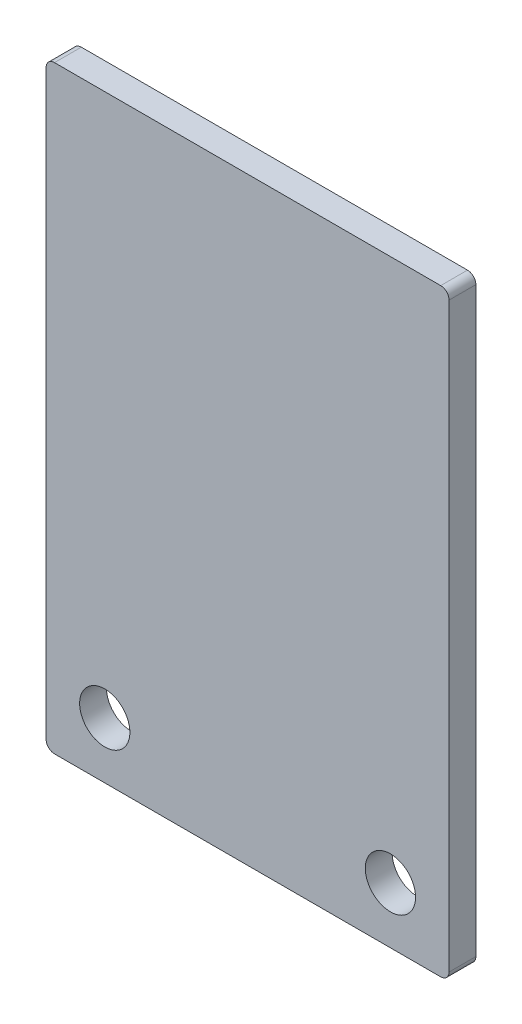
ISO-10303-21;
HEADER;
FILE_DESCRIPTION(('STEP AP214'),'2;1');
FILE_NAME('part.step','',(''),(''),'','','');
FILE_SCHEMA(('AUTOMOTIVE_DESIGN { 1 0 10303 214 1 1 1 1 }'));
ENDSEC;
DATA;
#1=APPLICATION_CONTEXT('core data for automotive mechanical design processes');
#2=APPLICATION_PROTOCOL_DEFINITION('international standard','automotive_design',2000,#1);
#3=PRODUCT_CONTEXT('',#1,'mechanical');
#4=PRODUCT('Part','Part','',(#3));
#5=PRODUCT_RELATED_PRODUCT_CATEGORY('part','',(#4));
#6=PRODUCT_DEFINITION_FORMATION('','',#4);
#7=PRODUCT_DEFINITION_CONTEXT('part definition',#1,'design');
#8=PRODUCT_DEFINITION('design','',#6,#7);
#9=PRODUCT_DEFINITION_SHAPE('','',#8);
#10=(LENGTH_UNIT() NAMED_UNIT(*) SI_UNIT(.MILLI.,.METRE.));
#11=(NAMED_UNIT(*) PLANE_ANGLE_UNIT() SI_UNIT($,.RADIAN.));
#12=(NAMED_UNIT(*) SI_UNIT($,.STERADIAN.) SOLID_ANGLE_UNIT());
#13=UNCERTAINTY_MEASURE_WITH_UNIT(LENGTH_MEASURE(1.E-05),#10,'distance_accuracy_value','');
#14=(GEOMETRIC_REPRESENTATION_CONTEXT(3) GLOBAL_UNCERTAINTY_ASSIGNED_CONTEXT((#13)) GLOBAL_UNIT_ASSIGNED_CONTEXT((#10,
#11,#12)) REPRESENTATION_CONTEXT('',''));
#15=CARTESIAN_POINT('',(0.,0.,0.));
#16=DIRECTION('',(0.,0.,1.));
#17=DIRECTION('',(1.,0.,0.));
#18=AXIS2_PLACEMENT_3D('',#15,#16,#17);
#19=CARTESIAN_POINT('',(0.500000000000001,0.5,1.6));
#20=DIRECTION('',(0.,0.,-1.));
#21=DIRECTION('',(-1.,0.,0.));
#22=AXIS2_PLACEMENT_3D('',#19,#20,#21);
#23=CYLINDRICAL_SURFACE('',#22,0.5);
#24=CARTESIAN_POINT('',(0.500000000000001,0.5,0.));
#25=DIRECTION('',(0.,0.,1.));
#26=DIRECTION('',(1.,0.,0.));
#27=AXIS2_PLACEMENT_3D('',#24,#25,#26);
#28=CIRCLE('',#27,0.5);
#29=CARTESIAN_POINT('',(0.,0.5,0.));
#30=VERTEX_POINT('',#29);
#31=CARTESIAN_POINT('',(0.5,0.,0.));
#32=VERTEX_POINT('',#31);
#33=EDGE_CURVE('E137',#30,#32,#28,.T.);
#34=ORIENTED_EDGE('',*,*,#33,.T.);
#35=DIRECTION('',(0.,0.,-1.));
#36=VECTOR('',#35,1.);
#37=CARTESIAN_POINT('',(0.5,0.,1.6));
#38=LINE('',#37,#36);
#39=CARTESIAN_POINT('',(0.5,0.,1.6));
#40=VERTEX_POINT('',#39);
#41=EDGE_CURVE('E11',#40,#32,#38,.T.);
#42=ORIENTED_EDGE('',*,*,#41,.F.);
#43=CARTESIAN_POINT('',(0.500000000000001,0.5,1.6));
#44=DIRECTION('',(0.,0.,1.));
#45=DIRECTION('',(1.,0.,0.));
#46=AXIS2_PLACEMENT_3D('',#43,#44,#45);
#47=CIRCLE('',#46,0.5);
#48=CARTESIAN_POINT('',(0.,0.5,1.6));
#49=VERTEX_POINT('',#48);
#50=EDGE_CURVE('E155',#49,#40,#47,.T.);
#51=ORIENTED_EDGE('',*,*,#50,.F.);
#52=DIRECTION('',(0.,0.,-1.));
#53=VECTOR('',#52,1.);
#54=CARTESIAN_POINT('',(0.,0.5,1.6));
#55=LINE('',#54,#53);
#56=EDGE_CURVE('E133',#49,#30,#55,.T.);
#57=ORIENTED_EDGE('',*,*,#56,.T.);
#58=EDGE_LOOP('',(#34,#42,#51,#57));
#59=FACE_BOUND('',#58,.T.);
#60=ADVANCED_FACE('F41',(#59),#23,.T.);
#61=CARTESIAN_POINT('',(0.5,0.,1.6));
#62=DIRECTION('',(0.,1.,0.));
#63=DIRECTION('',(0.,0.,1.));
#64=AXIS2_PLACEMENT_3D('',#61,#62,#63);
#65=PLANE('',#64);
#66=DIRECTION('',(1.,0.,0.));
#67=VECTOR('',#66,1.);
#68=CARTESIAN_POINT('',(0.5,0.,0.));
#69=LINE('',#68,#67);
#70=CARTESIAN_POINT('',(23.55,0.,0.));
#71=VERTEX_POINT('',#70);
#72=EDGE_CURVE('E140',#32,#71,#69,.T.);
#73=ORIENTED_EDGE('',*,*,#72,.T.);
#74=DIRECTION('',(0.,0.,-1.));
#75=VECTOR('',#74,1.);
#76=CARTESIAN_POINT('',(23.55,0.,1.6));
#77=LINE('',#76,#75);
#78=CARTESIAN_POINT('',(23.55,0.,1.6));
#79=VERTEX_POINT('',#78);
#80=EDGE_CURVE('E47',#79,#71,#77,.T.);
#81=ORIENTED_EDGE('',*,*,#80,.F.);
#82=DIRECTION('',(1.,0.,0.));
#83=VECTOR('',#82,1.);
#84=CARTESIAN_POINT('',(0.5,0.,1.6));
#85=LINE('',#84,#83);
#86=EDGE_CURVE('E99',#40,#79,#85,.T.);
#87=ORIENTED_EDGE('',*,*,#86,.F.);
#88=ORIENTED_EDGE('',*,*,#41,.T.);
#89=EDGE_LOOP('',(#73,#81,#87,#88));
#90=FACE_BOUND('',#89,.T.);
#91=ADVANCED_FACE('F211',(#90),#65,.F.);
#92=CARTESIAN_POINT('',(23.55,0.500000000000003,1.6));
#93=DIRECTION('',(0.,0.,-1.));
#94=DIRECTION('',(-1.,0.,0.));
#95=AXIS2_PLACEMENT_3D('',#92,#93,#94);
#96=CYLINDRICAL_SURFACE('',#95,0.500000000000003);
#97=CARTESIAN_POINT('',(23.55,0.500000000000003,0.));
#98=DIRECTION('',(0.,0.,1.));
#99=DIRECTION('',(1.,0.,0.));
#100=AXIS2_PLACEMENT_3D('',#97,#98,#99);
#101=CIRCLE('',#100,0.500000000000003);
#102=CARTESIAN_POINT('',(24.05,0.500000000000003,0.));
#103=VERTEX_POINT('',#102);
#104=EDGE_CURVE('E141',#71,#103,#101,.T.);
#105=ORIENTED_EDGE('',*,*,#104,.T.);
#106=DIRECTION('',(0.,0.,-1.));
#107=VECTOR('',#106,1.);
#108=CARTESIAN_POINT('',(24.05,0.500000000000003,1.6));
#109=LINE('',#108,#107);
#110=CARTESIAN_POINT('',(24.05,0.500000000000003,1.6));
#111=VERTEX_POINT('',#110);
#112=EDGE_CURVE('E157',#111,#103,#109,.T.);
#113=ORIENTED_EDGE('',*,*,#112,.F.);
#114=CARTESIAN_POINT('',(23.55,0.500000000000003,1.6));
#115=DIRECTION('',(0.,0.,1.));
#116=DIRECTION('',(1.,0.,0.));
#117=AXIS2_PLACEMENT_3D('',#114,#115,#116);
#118=CIRCLE('',#117,0.500000000000003);
#119=EDGE_CURVE('E170',#79,#111,#118,.T.);
#120=ORIENTED_EDGE('',*,*,#119,.F.);
#121=ORIENTED_EDGE('',*,*,#80,.T.);
#122=EDGE_LOOP('',(#105,#113,#120,#121));
#123=FACE_BOUND('',#122,.T.);
#124=ADVANCED_FACE('F164',(#123),#96,.T.);
#125=CARTESIAN_POINT('',(24.05,0.5,1.6));
#126=DIRECTION('',(-1.,0.,0.));
#127=DIRECTION('',(0.,0.,1.));
#128=AXIS2_PLACEMENT_3D('',#125,#126,#127);
#129=PLANE('',#128);
#130=DIRECTION('',(0.,1.,0.));
#131=VECTOR('',#130,1.);
#132=CARTESIAN_POINT('',(24.05,0.5,0.));
#133=LINE('',#132,#131);
#134=CARTESIAN_POINT('',(24.05,35.23,0.));
#135=VERTEX_POINT('',#134);
#136=EDGE_CURVE('E144',#103,#135,#133,.T.);
#137=ORIENTED_EDGE('',*,*,#136,.T.);
#138=DIRECTION('',(0.,0.,-1.));
#139=VECTOR('',#138,1.);
#140=CARTESIAN_POINT('',(24.05,35.23,1.6));
#141=LINE('',#140,#139);
#142=CARTESIAN_POINT('',(24.05,35.23,1.6));
#143=VERTEX_POINT('',#142);
#144=EDGE_CURVE('E156',#143,#135,#141,.T.);
#145=ORIENTED_EDGE('',*,*,#144,.F.);
#146=DIRECTION('',(0.,1.,0.));
#147=VECTOR('',#146,1.);
#148=CARTESIAN_POINT('',(24.05,0.5,1.6));
#149=LINE('',#148,#147);
#150=EDGE_CURVE('E178',#111,#143,#149,.T.);
#151=ORIENTED_EDGE('',*,*,#150,.F.);
#152=ORIENTED_EDGE('',*,*,#112,.T.);
#153=EDGE_LOOP('',(#137,#145,#151,#152));
#154=FACE_BOUND('',#153,.T.);
#155=ADVANCED_FACE('F171',(#154),#129,.F.);
#156=CARTESIAN_POINT('',(23.55,35.23,1.6));
#157=DIRECTION('',(0.,0.,-1.));
#158=DIRECTION('',(-1.,0.,0.));
#159=AXIS2_PLACEMENT_3D('',#156,#157,#158);
#160=CYLINDRICAL_SURFACE('',#159,0.499999999999994);
#161=CARTESIAN_POINT('',(23.55,35.23,0.));
#162=DIRECTION('',(0.,0.,1.));
#163=DIRECTION('',(1.,0.,0.));
#164=AXIS2_PLACEMENT_3D('',#161,#162,#163);
#165=CIRCLE('',#164,0.499999999999994);
#166=CARTESIAN_POINT('',(23.55,35.73,0.));
#167=VERTEX_POINT('',#166);
#168=EDGE_CURVE('E150',#135,#167,#165,.T.);
#169=ORIENTED_EDGE('',*,*,#168,.T.);
#170=DIRECTION('',(0.,0.,-1.));
#171=VECTOR('',#170,1.);
#172=CARTESIAN_POINT('',(23.55,35.73,1.6));
#173=LINE('',#172,#171);
#174=CARTESIAN_POINT('',(23.55,35.73,1.6));
#175=VERTEX_POINT('',#174);
#176=EDGE_CURVE('E126',#175,#167,#173,.T.);
#177=ORIENTED_EDGE('',*,*,#176,.F.);
#178=CARTESIAN_POINT('',(23.55,35.23,1.6));
#179=DIRECTION('',(0.,0.,1.));
#180=DIRECTION('',(1.,0.,0.));
#181=AXIS2_PLACEMENT_3D('',#178,#179,#180);
#182=CIRCLE('',#181,0.499999999999994);
#183=EDGE_CURVE('E119',#143,#175,#182,.T.);
#184=ORIENTED_EDGE('',*,*,#183,.F.);
#185=ORIENTED_EDGE('',*,*,#144,.T.);
#186=EDGE_LOOP('',(#169,#177,#184,#185));
#187=FACE_BOUND('',#186,.T.);
#188=ADVANCED_FACE('F179',(#187),#160,.T.);
#189=CARTESIAN_POINT('',(23.55,35.73,1.6));
#190=DIRECTION('',(0.,-1.,0.));
#191=DIRECTION('',(0.,0.,-1.));
#192=AXIS2_PLACEMENT_3D('',#189,#190,#191);
#193=PLANE('',#192);
#194=DIRECTION('',(-1.,0.,0.));
#195=VECTOR('',#194,1.);
#196=CARTESIAN_POINT('',(23.55,35.73,0.));
#197=LINE('',#196,#195);
#198=CARTESIAN_POINT('',(0.5,35.73,0.));
#199=VERTEX_POINT('',#198);
#200=EDGE_CURVE('E130',#167,#199,#197,.T.);
#201=ORIENTED_EDGE('',*,*,#200,.T.);
#202=DIRECTION('',(0.,0.,-1.));
#203=VECTOR('',#202,1.);
#204=CARTESIAN_POINT('',(0.5,35.73,1.6));
#205=LINE('',#204,#203);
#206=CARTESIAN_POINT('',(0.5,35.73,1.6));
#207=VERTEX_POINT('',#206);
#208=EDGE_CURVE('E123',#207,#199,#205,.T.);
#209=ORIENTED_EDGE('',*,*,#208,.F.);
#210=DIRECTION('',(-1.,0.,0.));
#211=VECTOR('',#210,1.);
#212=CARTESIAN_POINT('',(23.55,35.73,1.6));
#213=LINE('',#212,#211);
#214=EDGE_CURVE('E114',#175,#207,#213,.T.);
#215=ORIENTED_EDGE('',*,*,#214,.F.);
#216=ORIENTED_EDGE('',*,*,#176,.T.);
#217=EDGE_LOOP('',(#201,#209,#215,#216));
#218=FACE_BOUND('',#217,.T.);
#219=ADVANCED_FACE('F125',(#218),#193,.F.);
#220=CARTESIAN_POINT('',(0.499999999999991,35.23,1.6));
#221=DIRECTION('',(0.,0.,-1.));
#222=DIRECTION('',(-1.,0.,0.));
#223=AXIS2_PLACEMENT_3D('',#220,#221,#222);
#224=CYLINDRICAL_SURFACE('',#223,0.499999999999989);
#225=CARTESIAN_POINT('',(0.499999999999991,35.23,0.));
#226=DIRECTION('',(0.,0.,1.));
#227=DIRECTION('',(1.,0.,0.));
#228=AXIS2_PLACEMENT_3D('',#225,#226,#227);
#229=CIRCLE('',#228,0.499999999999989);
#230=CARTESIAN_POINT('',(0.,35.23,0.));
#231=VERTEX_POINT('',#230);
#232=EDGE_CURVE('E88',#199,#231,#229,.T.);
#233=ORIENTED_EDGE('',*,*,#232,.T.);
#234=DIRECTION('',(0.,0.,-1.));
#235=VECTOR('',#234,1.);
#236=CARTESIAN_POINT('',(0.,35.23,1.6));
#237=LINE('',#236,#235);
#238=CARTESIAN_POINT('',(0.,35.23,1.6));
#239=VERTEX_POINT('',#238);
#240=EDGE_CURVE('E129',#239,#231,#237,.T.);
#241=ORIENTED_EDGE('',*,*,#240,.F.);
#242=CARTESIAN_POINT('',(0.499999999999991,35.23,1.6));
#243=DIRECTION('',(0.,0.,1.));
#244=DIRECTION('',(1.,0.,0.));
#245=AXIS2_PLACEMENT_3D('',#242,#243,#244);
#246=CIRCLE('',#245,0.499999999999989);
#247=EDGE_CURVE('E120',#207,#239,#246,.T.);
#248=ORIENTED_EDGE('',*,*,#247,.F.);
#249=ORIENTED_EDGE('',*,*,#208,.T.);
#250=EDGE_LOOP('',(#233,#241,#248,#249));
#251=FACE_BOUND('',#250,.T.);
#252=ADVANCED_FACE('F132',(#251),#224,.T.);
#253=CARTESIAN_POINT('',(0.,35.23,1.6));
#254=DIRECTION('',(1.,0.,0.));
#255=DIRECTION('',(0.,0.,-1.));
#256=AXIS2_PLACEMENT_3D('',#253,#254,#255);
#257=PLANE('',#256);
#258=DIRECTION('',(0.,-1.,0.));
#259=VECTOR('',#258,1.);
#260=CARTESIAN_POINT('',(0.,35.23,0.));
#261=LINE('',#260,#259);
#262=EDGE_CURVE('E95',#231,#30,#261,.T.);
#263=ORIENTED_EDGE('',*,*,#262,.T.);
#264=ORIENTED_EDGE('',*,*,#56,.F.);
#265=DIRECTION('',(0.,-1.,0.));
#266=VECTOR('',#265,1.);
#267=CARTESIAN_POINT('',(0.,35.23,1.6));
#268=LINE('',#267,#266);
#269=EDGE_CURVE('E60',#239,#49,#268,.T.);
#270=ORIENTED_EDGE('',*,*,#269,.F.);
#271=ORIENTED_EDGE('',*,*,#240,.T.);
#272=EDGE_LOOP('',(#263,#264,#270,#271));
#273=FACE_BOUND('',#272,.T.);
#274=ADVANCED_FACE('F217',(#273),#257,.F.);
#275=CARTESIAN_POINT('',(0.500000000000001,0.5,1.6));
#276=DIRECTION('',(0.,0.,1.));
#277=DIRECTION('',(1.,0.,0.));
#278=AXIS2_PLACEMENT_3D('',#275,#276,#277);
#279=PLANE('',#278);
#280=CARTESIAN_POINT('',(3.5,3.36,1.6));
#281=DIRECTION('',(0.,0.,1.));
#282=DIRECTION('',(1.,0.,0.));
#283=AXIS2_PLACEMENT_3D('',#280,#281,#282);
#284=CIRCLE('',#283,1.5);
#285=CARTESIAN_POINT('',(5.,3.36,1.6));
#286=VERTEX_POINT('',#285);
#287=EDGE_CURVE('E143',#286,#286,#284,.F.);
#288=ORIENTED_EDGE('',*,*,#287,.T.);
#289=EDGE_LOOP('',(#288));
#290=FACE_BOUND('',#289,.T.);
#291=CARTESIAN_POINT('',(20.55,3.36,1.6));
#292=DIRECTION('',(0.,0.,1.));
#293=DIRECTION('',(1.,0.,0.));
#294=AXIS2_PLACEMENT_3D('',#291,#292,#293);
#295=CIRCLE('',#294,1.5);
#296=CARTESIAN_POINT('',(22.05,3.36,1.6));
#297=VERTEX_POINT('',#296);
#298=EDGE_CURVE('E190',#297,#297,#295,.F.);
#299=ORIENTED_EDGE('',*,*,#298,.T.);
#300=EDGE_LOOP('',(#299));
#301=FACE_BOUND('',#300,.T.);
#302=ORIENTED_EDGE('',*,*,#50,.T.);
#303=ORIENTED_EDGE('',*,*,#86,.T.);
#304=ORIENTED_EDGE('',*,*,#119,.T.);
#305=ORIENTED_EDGE('',*,*,#150,.T.);
#306=ORIENTED_EDGE('',*,*,#183,.T.);
#307=ORIENTED_EDGE('',*,*,#214,.T.);
#308=ORIENTED_EDGE('',*,*,#247,.T.);
#309=ORIENTED_EDGE('',*,*,#269,.T.);
#310=EDGE_LOOP('',(#302,#303,#304,#305,#306,#307,#308,#309));
#311=FACE_BOUND('',#310,.T.);
#312=ADVANCED_FACE('F113',(#290,#301,#311),#279,.T.);
#313=CARTESIAN_POINT('',(0.500000000000001,0.5,0.));
#314=DIRECTION('',(0.,0.,1.));
#315=DIRECTION('',(1.,0.,0.));
#316=AXIS2_PLACEMENT_3D('',#313,#314,#315);
#317=PLANE('',#316);
#318=CARTESIAN_POINT('',(3.5,3.36,0.));
#319=DIRECTION('',(0.,0.,1.));
#320=DIRECTION('',(1.,0.,0.));
#321=AXIS2_PLACEMENT_3D('',#318,#319,#320);
#322=CIRCLE('',#321,1.5);
#323=CARTESIAN_POINT('',(5.,3.36,0.));
#324=VERTEX_POINT('',#323);
#325=EDGE_CURVE('E186',#324,#324,#322,.T.);
#326=ORIENTED_EDGE('',*,*,#325,.T.);
#327=EDGE_LOOP('',(#326));
#328=FACE_BOUND('',#327,.T.);
#329=CARTESIAN_POINT('',(20.55,3.36,0.));
#330=DIRECTION('',(0.,0.,1.));
#331=DIRECTION('',(1.,0.,0.));
#332=AXIS2_PLACEMENT_3D('',#329,#330,#331);
#333=CIRCLE('',#332,1.5);
#334=CARTESIAN_POINT('',(22.05,3.36,0.));
#335=VERTEX_POINT('',#334);
#336=EDGE_CURVE('E191',#335,#335,#333,.T.);
#337=ORIENTED_EDGE('',*,*,#336,.T.);
#338=EDGE_LOOP('',(#337));
#339=FACE_BOUND('',#338,.T.);
#340=ORIENTED_EDGE('',*,*,#33,.F.);
#341=ORIENTED_EDGE('',*,*,#262,.F.);
#342=ORIENTED_EDGE('',*,*,#232,.F.);
#343=ORIENTED_EDGE('',*,*,#200,.F.);
#344=ORIENTED_EDGE('',*,*,#168,.F.);
#345=ORIENTED_EDGE('',*,*,#136,.F.);
#346=ORIENTED_EDGE('',*,*,#104,.F.);
#347=ORIENTED_EDGE('',*,*,#72,.F.);
#348=EDGE_LOOP('',(#340,#341,#342,#343,#344,#345,#346,#347));
#349=FACE_BOUND('',#348,.T.);
#350=ADVANCED_FACE('F172',(#328,#339,#349),#317,.F.);
#351=CARTESIAN_POINT('',(20.55,3.36,2.));
#352=DIRECTION('',(0.,0.,-1.));
#353=DIRECTION('',(-1.,0.,0.));
#354=AXIS2_PLACEMENT_3D('',#351,#352,#353);
#355=CYLINDRICAL_SURFACE('',#354,1.5);
#356=ORIENTED_EDGE('',*,*,#298,.F.);
#357=EDGE_LOOP('',(#356));
#358=FACE_BOUND('',#357,.T.);
#359=ORIENTED_EDGE('',*,*,#336,.F.);
#360=EDGE_LOOP('',(#359));
#361=FACE_BOUND('',#360,.T.);
#362=ADVANCED_FACE('F203',(#358,#361),#355,.F.);
#363=CARTESIAN_POINT('',(3.5,3.36,2.));
#364=DIRECTION('',(0.,0.,-1.));
#365=DIRECTION('',(-1.,0.,0.));
#366=AXIS2_PLACEMENT_3D('',#363,#364,#365);
#367=CYLINDRICAL_SURFACE('',#366,1.5);
#368=ORIENTED_EDGE('',*,*,#287,.F.);
#369=EDGE_LOOP('',(#368));
#370=FACE_BOUND('',#369,.T.);
#371=ORIENTED_EDGE('',*,*,#325,.F.);
#372=EDGE_LOOP('',(#371));
#373=FACE_BOUND('',#372,.T.);
#374=ADVANCED_FACE('F200',(#370,#373),#367,.F.);
#375=CLOSED_SHELL('',(#60,#91,#124,#155,#188,#219,#252,#274,#312,#350,#362,#374));
#376=MANIFOLD_SOLID_BREP('B2',#375);
#377=ADVANCED_BREP_SHAPE_REPRESENTATION('',(#18,#376),#14);
#378=SHAPE_DEFINITION_REPRESENTATION(#9,#377);
ENDSEC;
END-ISO-10303-21;
